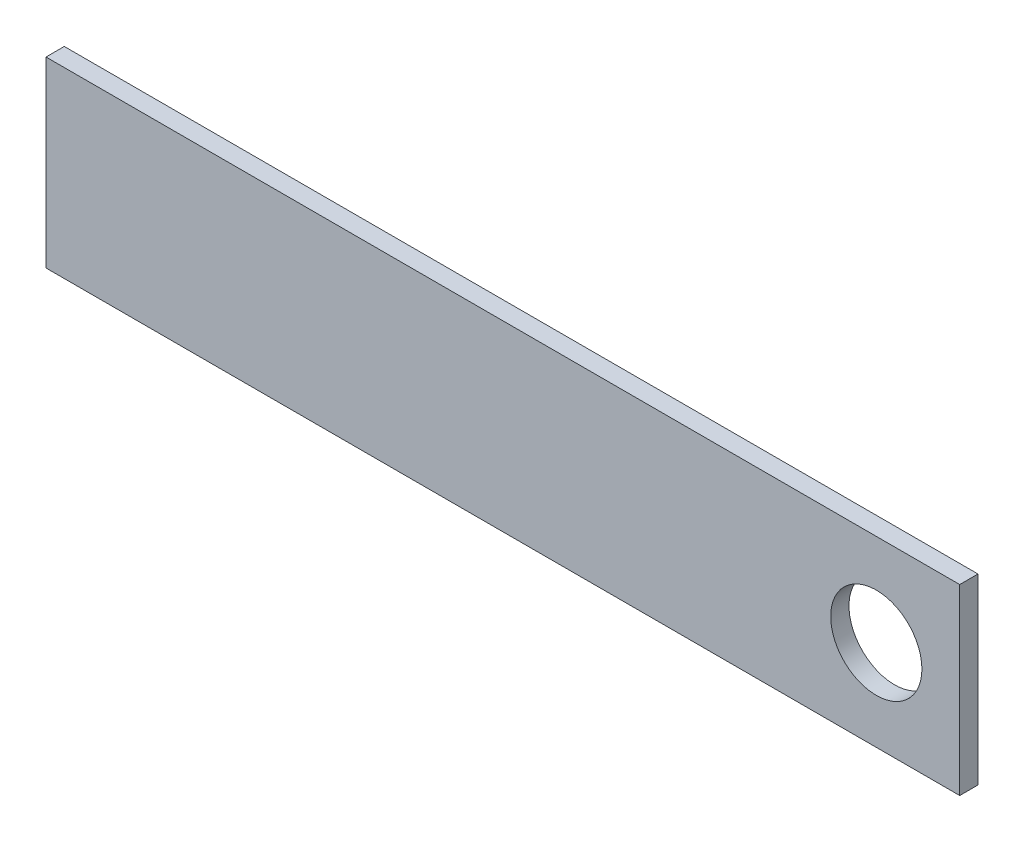
ISO-10303-21;
HEADER;
FILE_DESCRIPTION(('STEP AP214'),'2;1');
FILE_NAME('part.step','',(''),(''),'','','');
FILE_SCHEMA(('AUTOMOTIVE_DESIGN { 1 0 10303 214 1 1 1 1 }'));
ENDSEC;
DATA;
#1=APPLICATION_CONTEXT('core data for automotive mechanical design processes');
#2=APPLICATION_PROTOCOL_DEFINITION('international standard','automotive_design',2000,#1);
#3=PRODUCT_CONTEXT('',#1,'mechanical');
#4=PRODUCT('Part','Part','',(#3));
#5=PRODUCT_RELATED_PRODUCT_CATEGORY('part','',(#4));
#6=PRODUCT_DEFINITION_FORMATION('','',#4);
#7=PRODUCT_DEFINITION_CONTEXT('part definition',#1,'design');
#8=PRODUCT_DEFINITION('design','',#6,#7);
#9=PRODUCT_DEFINITION_SHAPE('','',#8);
#10=(LENGTH_UNIT() NAMED_UNIT(*) SI_UNIT(.MILLI.,.METRE.));
#11=(NAMED_UNIT(*) PLANE_ANGLE_UNIT() SI_UNIT($,.RADIAN.));
#12=(NAMED_UNIT(*) SI_UNIT($,.STERADIAN.) SOLID_ANGLE_UNIT());
#13=UNCERTAINTY_MEASURE_WITH_UNIT(LENGTH_MEASURE(1.E-05),#10,'distance_accuracy_value','');
#14=(GEOMETRIC_REPRESENTATION_CONTEXT(3) GLOBAL_UNCERTAINTY_ASSIGNED_CONTEXT((#13)) GLOBAL_UNIT_ASSIGNED_CONTEXT((#10,
#11,#12)) REPRESENTATION_CONTEXT('',''));
#15=CARTESIAN_POINT('',(0.,0.,0.));
#16=DIRECTION('',(0.,0.,1.));
#17=DIRECTION('',(1.,0.,0.));
#18=AXIS2_PLACEMENT_3D('',#15,#16,#17);
#19=CARTESIAN_POINT('',(0.,20.,0.));
#20=DIRECTION('',(1.,0.,0.));
#21=DIRECTION('',(0.,0.,-1.));
#22=AXIS2_PLACEMENT_3D('',#19,#20,#21);
#23=PLANE('',#22);
#24=DIRECTION('',(0.,0.,1.));
#25=VECTOR('',#24,1.);
#26=CARTESIAN_POINT('',(0.,0.,0.));
#27=LINE('',#26,#25);
#28=CARTESIAN_POINT('',(0.,0.,-2.));
#29=VERTEX_POINT('',#28);
#30=CARTESIAN_POINT('',(0.,0.,0.));
#31=VERTEX_POINT('',#30);
#32=EDGE_CURVE('E96',#29,#31,#27,.T.);
#33=ORIENTED_EDGE('',*,*,#32,.T.);
#34=DIRECTION('',(0.,-1.,0.));
#35=VECTOR('',#34,1.);
#36=CARTESIAN_POINT('',(0.,20.,0.));
#37=LINE('',#36,#35);
#38=CARTESIAN_POINT('',(0.,20.,0.));
#39=VERTEX_POINT('',#38);
#40=EDGE_CURVE('E11',#39,#31,#37,.T.);
#41=ORIENTED_EDGE('',*,*,#40,.F.);
#42=DIRECTION('',(0.,0.,1.));
#43=VECTOR('',#42,1.);
#44=CARTESIAN_POINT('',(0.,20.,0.));
#45=LINE('',#44,#43);
#46=CARTESIAN_POINT('',(0.,20.,-2.));
#47=VERTEX_POINT('',#46);
#48=EDGE_CURVE('E84',#47,#39,#45,.T.);
#49=ORIENTED_EDGE('',*,*,#48,.F.);
#50=DIRECTION('',(0.,-1.,0.));
#51=VECTOR('',#50,1.);
#52=CARTESIAN_POINT('',(0.,20.,-2.));
#53=LINE('',#52,#51);
#54=EDGE_CURVE('E92',#47,#29,#53,.T.);
#55=ORIENTED_EDGE('',*,*,#54,.T.);
#56=EDGE_LOOP('',(#33,#41,#49,#55));
#57=FACE_BOUND('',#56,.T.);
#58=ADVANCED_FACE('F33',(#57),#23,.F.);
#59=CARTESIAN_POINT('',(0.,20.,0.));
#60=DIRECTION('',(0.,0.,-1.));
#61=DIRECTION('',(-1.,0.,0.));
#62=AXIS2_PLACEMENT_3D('',#59,#60,#61);
#63=PLANE('',#62);
#64=CARTESIAN_POINT('',(90.8700637673263,9.91974419356211,0.));
#65=DIRECTION('',(0.,0.,1.));
#66=DIRECTION('',(1.,0.,0.));
#67=AXIS2_PLACEMENT_3D('',#64,#65,#66);
#68=CIRCLE('',#67,4.99131700544809);
#69=CARTESIAN_POINT('',(95.8613807727744,9.91974419356211,0.));
#70=VERTEX_POINT('',#69);
#71=EDGE_CURVE('E110',#70,#70,#68,.T.);
#72=ORIENTED_EDGE('',*,*,#71,.F.);
#73=EDGE_LOOP('',(#72));
#74=FACE_BOUND('',#73,.T.);
#75=DIRECTION('',(1.,0.,0.));
#76=VECTOR('',#75,1.);
#77=CARTESIAN_POINT('',(0.,0.,0.));
#78=LINE('',#77,#76);
#79=CARTESIAN_POINT('',(100.,0.,0.));
#80=VERTEX_POINT('',#79);
#81=EDGE_CURVE('E88',#31,#80,#78,.T.);
#82=ORIENTED_EDGE('',*,*,#81,.T.);
#83=DIRECTION('',(0.,-1.,0.));
#84=VECTOR('',#83,1.);
#85=CARTESIAN_POINT('',(100.,20.,0.));
#86=LINE('',#85,#84);
#87=CARTESIAN_POINT('',(100.,20.,0.));
#88=VERTEX_POINT('',#87);
#89=EDGE_CURVE('E41',#88,#80,#86,.T.);
#90=ORIENTED_EDGE('',*,*,#89,.F.);
#91=DIRECTION('',(1.,0.,0.));
#92=VECTOR('',#91,1.);
#93=CARTESIAN_POINT('',(0.,20.,0.));
#94=LINE('',#93,#92);
#95=EDGE_CURVE('E79',#39,#88,#94,.T.);
#96=ORIENTED_EDGE('',*,*,#95,.F.);
#97=ORIENTED_EDGE('',*,*,#40,.T.);
#98=EDGE_LOOP('',(#82,#90,#96,#97));
#99=FACE_BOUND('',#98,.T.);
#100=ADVANCED_FACE('F87',(#74,#99),#63,.F.);
#101=CARTESIAN_POINT('',(100.,20.,0.));
#102=DIRECTION('',(-1.,0.,0.));
#103=DIRECTION('',(0.,0.,1.));
#104=AXIS2_PLACEMENT_3D('',#101,#102,#103);
#105=PLANE('',#104);
#106=DIRECTION('',(0.,0.,-1.));
#107=VECTOR('',#106,1.);
#108=CARTESIAN_POINT('',(100.,0.,0.));
#109=LINE('',#108,#107);
#110=CARTESIAN_POINT('',(100.,0.,-2.));
#111=VERTEX_POINT('',#110);
#112=EDGE_CURVE('E66',#80,#111,#109,.T.);
#113=ORIENTED_EDGE('',*,*,#112,.T.);
#114=DIRECTION('',(0.,-1.,0.));
#115=VECTOR('',#114,1.);
#116=CARTESIAN_POINT('',(100.,20.,-2.));
#117=LINE('',#116,#115);
#118=CARTESIAN_POINT('',(100.,20.,-2.));
#119=VERTEX_POINT('',#118);
#120=EDGE_CURVE('E89',#119,#111,#117,.T.);
#121=ORIENTED_EDGE('',*,*,#120,.F.);
#122=DIRECTION('',(0.,0.,-1.));
#123=VECTOR('',#122,1.);
#124=CARTESIAN_POINT('',(100.,20.,0.));
#125=LINE('',#124,#123);
#126=EDGE_CURVE('E82',#88,#119,#125,.T.);
#127=ORIENTED_EDGE('',*,*,#126,.F.);
#128=ORIENTED_EDGE('',*,*,#89,.T.);
#129=EDGE_LOOP('',(#113,#121,#127,#128));
#130=FACE_BOUND('',#129,.T.);
#131=ADVANCED_FACE('F90',(#130),#105,.F.);
#132=CARTESIAN_POINT('',(0.,20.,-2.));
#133=DIRECTION('',(0.,0.,1.));
#134=DIRECTION('',(1.,0.,0.));
#135=AXIS2_PLACEMENT_3D('',#132,#133,#134);
#136=PLANE('',#135);
#137=CARTESIAN_POINT('',(90.8700637673263,9.91974419356211,-2.));
#138=DIRECTION('',(0.,0.,1.));
#139=DIRECTION('',(1.,0.,0.));
#140=AXIS2_PLACEMENT_3D('',#137,#138,#139);
#141=CIRCLE('',#140,4.99131700544809);
#142=CARTESIAN_POINT('',(95.8613807727744,9.91974419356211,-2.));
#143=VERTEX_POINT('',#142);
#144=EDGE_CURVE('E99',#143,#143,#141,.T.);
#145=ORIENTED_EDGE('',*,*,#144,.T.);
#146=EDGE_LOOP('',(#145));
#147=FACE_BOUND('',#146,.T.);
#148=DIRECTION('',(-1.,0.,0.));
#149=VECTOR('',#148,1.);
#150=CARTESIAN_POINT('',(0.,0.,-2.));
#151=LINE('',#150,#149);
#152=EDGE_CURVE('E72',#111,#29,#151,.T.);
#153=ORIENTED_EDGE('',*,*,#152,.T.);
#154=ORIENTED_EDGE('',*,*,#54,.F.);
#155=DIRECTION('',(-1.,0.,0.));
#156=VECTOR('',#155,1.);
#157=CARTESIAN_POINT('',(0.,20.,-2.));
#158=LINE('',#157,#156);
#159=EDGE_CURVE('E49',#119,#47,#158,.T.);
#160=ORIENTED_EDGE('',*,*,#159,.F.);
#161=ORIENTED_EDGE('',*,*,#120,.T.);
#162=EDGE_LOOP('',(#153,#154,#160,#161));
#163=FACE_BOUND('',#162,.T.);
#164=ADVANCED_FACE('F104',(#147,#163),#136,.F.);
#165=CARTESIAN_POINT('',(0.,20.,0.));
#166=DIRECTION('',(0.,-1.,0.));
#167=DIRECTION('',(0.,0.,-1.));
#168=AXIS2_PLACEMENT_3D('',#165,#166,#167);
#169=PLANE('',#168);
#170=ORIENTED_EDGE('',*,*,#48,.T.);
#171=ORIENTED_EDGE('',*,*,#95,.T.);
#172=ORIENTED_EDGE('',*,*,#126,.T.);
#173=ORIENTED_EDGE('',*,*,#159,.T.);
#174=EDGE_LOOP('',(#170,#171,#172,#173));
#175=FACE_BOUND('',#174,.T.);
#176=ADVANCED_FACE('F80',(#175),#169,.F.);
#177=CARTESIAN_POINT('',(0.,0.,0.));
#178=DIRECTION('',(0.,-1.,0.));
#179=DIRECTION('',(0.,0.,-1.));
#180=AXIS2_PLACEMENT_3D('',#177,#178,#179);
#181=PLANE('',#180);
#182=ORIENTED_EDGE('',*,*,#32,.F.);
#183=ORIENTED_EDGE('',*,*,#152,.F.);
#184=ORIENTED_EDGE('',*,*,#112,.F.);
#185=ORIENTED_EDGE('',*,*,#81,.F.);
#186=EDGE_LOOP('',(#182,#183,#184,#185));
#187=FACE_BOUND('',#186,.T.);
#188=ADVANCED_FACE('F107',(#187),#181,.T.);
#189=CARTESIAN_POINT('',(90.8700637673263,9.91974419356211,-2.));
#190=DIRECTION('',(0.,0.,1.));
#191=DIRECTION('',(1.,0.,0.));
#192=AXIS2_PLACEMENT_3D('',#189,#190,#191);
#193=CYLINDRICAL_SURFACE('',#192,4.99131700544809);
#194=ORIENTED_EDGE('',*,*,#144,.F.);
#195=EDGE_LOOP('',(#194));
#196=FACE_BOUND('',#195,.T.);
#197=ORIENTED_EDGE('',*,*,#71,.T.);
#198=EDGE_LOOP('',(#197));
#199=FACE_BOUND('',#198,.T.);
#200=ADVANCED_FACE('F117',(#196,#199),#193,.F.);
#201=CLOSED_SHELL('',(#58,#100,#131,#164,#176,#188,#200));
#202=MANIFOLD_SOLID_BREP('B2',#201);
#203=ADVANCED_BREP_SHAPE_REPRESENTATION('',(#18,#202),#14);
#204=SHAPE_DEFINITION_REPRESENTATION(#9,#203);
ENDSEC;
END-ISO-10303-21;
